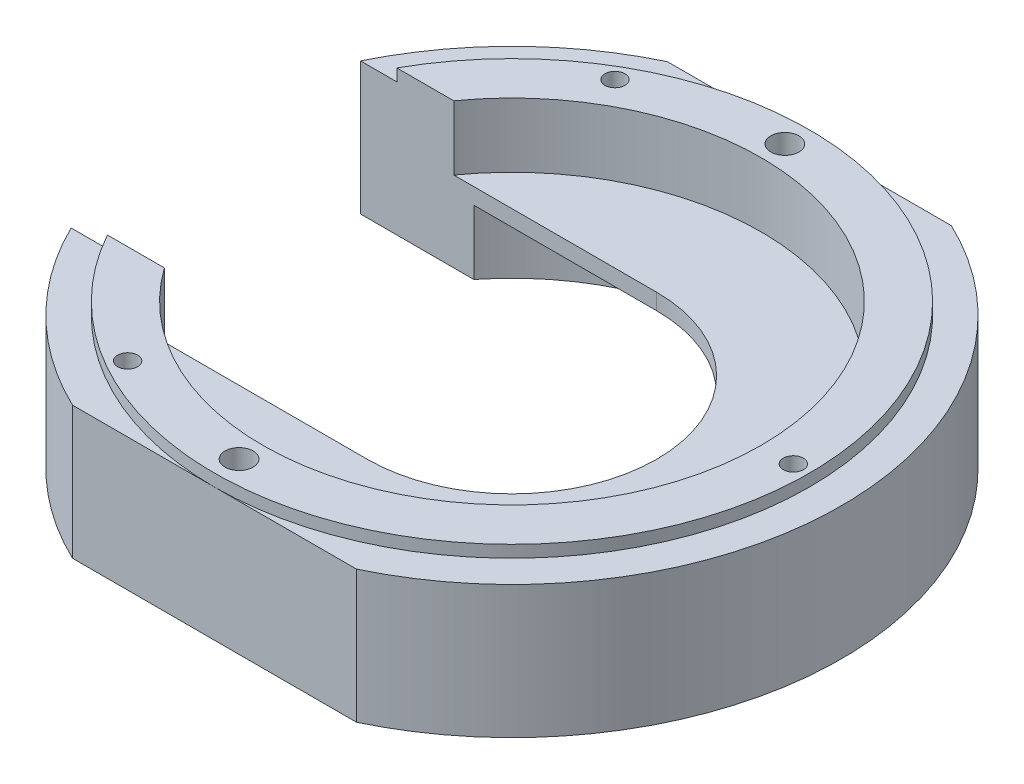
ISO-10303-21;
HEADER;
FILE_DESCRIPTION(('STEP AP214'),'2;1');
FILE_NAME('part.step','',(''),(''),'','','');
FILE_SCHEMA(('AUTOMOTIVE_DESIGN { 1 0 10303 214 1 1 1 1 }'));
ENDSEC;
DATA;
#1=APPLICATION_CONTEXT('core data for automotive mechanical design processes');
#2=APPLICATION_PROTOCOL_DEFINITION('international standard','automotive_design',2000,#1);
#3=PRODUCT_CONTEXT('',#1,'mechanical');
#4=PRODUCT('Part','Part','',(#3));
#5=PRODUCT_RELATED_PRODUCT_CATEGORY('part','',(#4));
#6=PRODUCT_DEFINITION_FORMATION('','',#4);
#7=PRODUCT_DEFINITION_CONTEXT('part definition',#1,'design');
#8=PRODUCT_DEFINITION('design','',#6,#7);
#9=PRODUCT_DEFINITION_SHAPE('','',#8);
#10=(LENGTH_UNIT() NAMED_UNIT(*) SI_UNIT(.MILLI.,.METRE.));
#11=(NAMED_UNIT(*) PLANE_ANGLE_UNIT() SI_UNIT($,.RADIAN.));
#12=(NAMED_UNIT(*) SI_UNIT($,.STERADIAN.) SOLID_ANGLE_UNIT());
#13=UNCERTAINTY_MEASURE_WITH_UNIT(LENGTH_MEASURE(1.E-05),#10,'distance_accuracy_value','');
#14=(GEOMETRIC_REPRESENTATION_CONTEXT(3) GLOBAL_UNCERTAINTY_ASSIGNED_CONTEXT((#13)) GLOBAL_UNIT_ASSIGNED_CONTEXT((#10,
#11,#12)) REPRESENTATION_CONTEXT('',''));
#15=CARTESIAN_POINT('',(0.,0.,0.));
#16=DIRECTION('',(0.,0.,1.));
#17=DIRECTION('',(1.,0.,0.));
#18=AXIS2_PLACEMENT_3D('',#15,#16,#17);
#19=CARTESIAN_POINT('',(0.,0.,0.));
#20=DIRECTION('',(0.,1.,0.));
#21=DIRECTION('',(0.,0.,1.));
#22=AXIS2_PLACEMENT_3D('',#19,#20,#21);
#23=PLANE('',#22);
#24=DIRECTION('',(1.,0.,0.));
#25=VECTOR('',#24,1.);
#26=CARTESIAN_POINT('',(0.,0.,18.));
#27=LINE('',#26,#25);
#28=CARTESIAN_POINT('',(-36.8374809127877,0.,18.));
#29=VERTEX_POINT('',#28);
#30=CARTESIAN_POINT('',(-22.7376340018041,0.,18.));
#31=VERTEX_POINT('',#30);
#32=EDGE_CURVE('E157',#29,#31,#27,.T.);
#33=ORIENTED_EDGE('',*,*,#32,.T.);
#34=CARTESIAN_POINT('',(0.,0.,0.));
#35=DIRECTION('',(0.,1.,0.));
#36=DIRECTION('',(0.,0.,1.));
#37=AXIS2_PLACEMENT_3D('',#34,#35,#36);
#38=CIRCLE('',#37,29.);
#39=CARTESIAN_POINT('',(-22.7376340018041,0.,-18.));
#40=VERTEX_POINT('',#39);
#41=EDGE_CURVE('E47',#31,#40,#38,.T.);
#42=ORIENTED_EDGE('',*,*,#41,.T.);
#43=DIRECTION('',(1.,0.,0.));
#44=VECTOR('',#43,1.);
#45=CARTESIAN_POINT('',(0.,0.,-18.));
#46=LINE('',#45,#44);
#47=CARTESIAN_POINT('',(-36.8374809127877,0.,-18.));
#48=VERTEX_POINT('',#47);
#49=EDGE_CURVE('E165',#48,#40,#46,.T.);
#50=ORIENTED_EDGE('',*,*,#49,.F.);
#51=CARTESIAN_POINT('',(0.,0.,0.));
#52=DIRECTION('',(0.,1.,0.));
#53=DIRECTION('',(0.,0.,1.));
#54=AXIS2_PLACEMENT_3D('',#51,#52,#53);
#55=CIRCLE('',#54,41.);
#56=CARTESIAN_POINT('',(-17.6635217326557,0.,-37.));
#57=VERTEX_POINT('',#56);
#58=EDGE_CURVE('E178',#57,#48,#55,.T.);
#59=ORIENTED_EDGE('',*,*,#58,.F.);
#60=DIRECTION('',(1.,0.,0.));
#61=VECTOR('',#60,1.);
#62=CARTESIAN_POINT('',(0.,0.,-37.));
#63=LINE('',#62,#61);
#64=CARTESIAN_POINT('',(17.6635217326557,0.,-37.));
#65=VERTEX_POINT('',#64);
#66=EDGE_CURVE('E177',#57,#65,#63,.T.);
#67=ORIENTED_EDGE('',*,*,#66,.T.);
#68=CARTESIAN_POINT('',(17.6635217326557,0.,37.));
#69=VERTEX_POINT('',#68);
#70=EDGE_CURVE('E174',#69,#65,#55,.T.);
#71=ORIENTED_EDGE('',*,*,#70,.F.);
#72=DIRECTION('',(1.,0.,0.));
#73=VECTOR('',#72,1.);
#74=CARTESIAN_POINT('',(0.,0.,37.));
#75=LINE('',#74,#73);
#76=CARTESIAN_POINT('',(-17.6635217326557,0.,37.));
#77=VERTEX_POINT('',#76);
#78=EDGE_CURVE('E167',#77,#69,#75,.T.);
#79=ORIENTED_EDGE('',*,*,#78,.F.);
#80=CARTESIAN_POINT('',(0.,0.,0.));
#81=DIRECTION('',(0.,1.,0.));
#82=DIRECTION('',(0.,0.,1.));
#83=AXIS2_PLACEMENT_3D('',#80,#81,#82);
#84=CIRCLE('',#83,41.);
#85=EDGE_CURVE('E164',#29,#77,#84,.T.);
#86=ORIENTED_EDGE('',*,*,#85,.F.);
#87=EDGE_LOOP('',(#33,#42,#50,#59,#67,#71,#79,#86));
#88=FACE_BOUND('',#87,.T.);
#89=CARTESIAN_POINT('',(35.,0.,0.));
#90=DIRECTION('',(0.,-1.,0.));
#91=DIRECTION('',(0.,0.,-1.));
#92=AXIS2_PLACEMENT_3D('',#89,#90,#91);
#93=CIRCLE('',#92,1.24999999999999);
#94=CARTESIAN_POINT('',(35.,0.,-1.24999999999999));
#95=VERTEX_POINT('',#94);
#96=EDGE_CURVE('E431',#95,#95,#93,.T.);
#97=ORIENTED_EDGE('',*,*,#96,.F.);
#98=EDGE_LOOP('',(#97));
#99=FACE_BOUND('',#98,.T.);
#100=CARTESIAN_POINT('',(-17.5000000000001,0.,30.3108891324553));
#101=DIRECTION('',(0.,-1.,0.));
#102=DIRECTION('',(0.,0.,-1.));
#103=AXIS2_PLACEMENT_3D('',#100,#101,#102);
#104=CIRCLE('',#103,1.24999999999999);
#105=CARTESIAN_POINT('',(-17.5000000000001,0.,29.0608891324553));
#106=VERTEX_POINT('',#105);
#107=EDGE_CURVE('E439',#106,#106,#104,.T.);
#108=ORIENTED_EDGE('',*,*,#107,.F.);
#109=EDGE_LOOP('',(#108));
#110=FACE_BOUND('',#109,.T.);
#111=CARTESIAN_POINT('',(-17.4999999999997,0.,-30.3108891324555));
#112=DIRECTION('',(0.,-1.,0.));
#113=DIRECTION('',(0.,0.,-1.));
#114=AXIS2_PLACEMENT_3D('',#111,#112,#113);
#115=CIRCLE('',#114,1.24999999999999);
#116=CARTESIAN_POINT('',(-17.4999999999997,0.,-31.5608891324555));
#117=VERTEX_POINT('',#116);
#118=EDGE_CURVE('E445',#117,#117,#115,.T.);
#119=ORIENTED_EDGE('',*,*,#118,.F.);
#120=EDGE_LOOP('',(#119));
#121=FACE_BOUND('',#120,.T.);
#122=CARTESIAN_POINT('',(0.,0.,33.95));
#123=DIRECTION('',(0.,-1.,0.));
#124=DIRECTION('',(0.,0.,-1.));
#125=AXIS2_PLACEMENT_3D('',#122,#123,#124);
#126=CIRCLE('',#125,3.);
#127=CARTESIAN_POINT('',(0.,0.,30.95));
#128=VERTEX_POINT('',#127);
#129=EDGE_CURVE('E457',#128,#128,#126,.T.);
#130=ORIENTED_EDGE('',*,*,#129,.F.);
#131=EDGE_LOOP('',(#130));
#132=FACE_BOUND('',#131,.T.);
#133=CARTESIAN_POINT('',(0.,0.,-33.95));
#134=DIRECTION('',(0.,-1.,0.));
#135=DIRECTION('',(0.,0.,-1.));
#136=AXIS2_PLACEMENT_3D('',#133,#134,#135);
#137=CIRCLE('',#136,3.);
#138=CARTESIAN_POINT('',(0.,0.,-36.95));
#139=VERTEX_POINT('',#138);
#140=EDGE_CURVE('E469',#139,#139,#137,.T.);
#141=ORIENTED_EDGE('',*,*,#140,.F.);
#142=EDGE_LOOP('',(#141));
#143=FACE_BOUND('',#142,.T.);
#144=ADVANCED_FACE('F39',(#88,#99,#110,#121,#132,#143),#23,.F.);
#145=CARTESIAN_POINT('',(0.,16.5,0.));
#146=DIRECTION('',(0.,-1.,0.));
#147=DIRECTION('',(0.,0.,-1.));
#148=AXIS2_PLACEMENT_3D('',#145,#146,#147);
#149=CYLINDRICAL_SURFACE('',#148,18.);
#150=CARTESIAN_POINT('',(0.,8.,0.));
#151=DIRECTION('',(0.,1.,0.));
#152=DIRECTION('',(0.,0.,1.));
#153=AXIS2_PLACEMENT_3D('',#150,#151,#152);
#154=CIRCLE('',#153,18.);
#155=CARTESIAN_POINT('',(0.,8.,18.));
#156=VERTEX_POINT('',#155);
#157=CARTESIAN_POINT('',(0.,8.,-18.));
#158=VERTEX_POINT('',#157);
#159=EDGE_CURVE('E217',#156,#158,#154,.T.);
#160=ORIENTED_EDGE('',*,*,#159,.F.);
#161=DIRECTION('',(0.,-1.,0.));
#162=VECTOR('',#161,1.);
#163=CARTESIAN_POINT('',(0.,16.5,18.));
#164=LINE('',#163,#162);
#165=CARTESIAN_POINT('',(0.,10.,18.));
#166=VERTEX_POINT('',#165);
#167=EDGE_CURVE('E197',#166,#156,#164,.T.);
#168=ORIENTED_EDGE('',*,*,#167,.F.);
#169=CARTESIAN_POINT('',(0.,10.,0.));
#170=DIRECTION('',(0.,1.,0.));
#171=DIRECTION('',(0.,0.,1.));
#172=AXIS2_PLACEMENT_3D('',#169,#170,#171);
#173=CIRCLE('',#172,18.);
#174=CARTESIAN_POINT('',(0.,10.,-18.));
#175=VERTEX_POINT('',#174);
#176=EDGE_CURVE('E215',#166,#175,#173,.T.);
#177=ORIENTED_EDGE('',*,*,#176,.T.);
#178=DIRECTION('',(0.,-1.,0.));
#179=VECTOR('',#178,1.);
#180=CARTESIAN_POINT('',(0.,16.5,-18.));
#181=LINE('',#180,#179);
#182=EDGE_CURVE('E199',#175,#158,#181,.T.);
#183=ORIENTED_EDGE('',*,*,#182,.T.);
#184=EDGE_LOOP('',(#160,#168,#177,#183));
#185=FACE_BOUND('',#184,.T.);
#186=ADVANCED_FACE('F214',(#185),#149,.F.);
#187=CARTESIAN_POINT('',(0.,16.5,0.));
#188=DIRECTION('',(0.,1.,0.));
#189=DIRECTION('',(0.,0.,1.));
#190=AXIS2_PLACEMENT_3D('',#187,#188,#189);
#191=PLANE('',#190);
#192=CARTESIAN_POINT('',(0.,16.5,0.));
#193=DIRECTION('',(0.,1.,0.));
#194=DIRECTION('',(0.,0.,1.));
#195=AXIS2_PLACEMENT_3D('',#192,#193,#194);
#196=CIRCLE('',#195,37.);
#197=CARTESIAN_POINT('',(-32.3264597504892,16.5,18.));
#198=VERTEX_POINT('',#197);
#199=CARTESIAN_POINT('',(0.,16.5,37.));
#200=VERTEX_POINT('',#199);
#201=EDGE_CURVE('E234',#198,#200,#196,.T.);
#202=ORIENTED_EDGE('',*,*,#201,.F.);
#203=DIRECTION('',(1.,0.,0.));
#204=VECTOR('',#203,1.);
#205=CARTESIAN_POINT('',(0.,16.5,18.));
#206=LINE('',#205,#204);
#207=CARTESIAN_POINT('',(-36.8374809127877,16.5,18.));
#208=VERTEX_POINT('',#207);
#209=EDGE_CURVE('E252',#208,#198,#206,.T.);
#210=ORIENTED_EDGE('',*,*,#209,.F.);
#211=CARTESIAN_POINT('',(0.,16.5,0.));
#212=DIRECTION('',(0.,1.,0.));
#213=DIRECTION('',(0.,0.,1.));
#214=AXIS2_PLACEMENT_3D('',#211,#212,#213);
#215=CIRCLE('',#214,41.);
#216=CARTESIAN_POINT('',(-17.6635217326557,16.5,37.));
#217=VERTEX_POINT('',#216);
#218=EDGE_CURVE('E255',#208,#217,#215,.T.);
#219=ORIENTED_EDGE('',*,*,#218,.T.);
#220=DIRECTION('',(1.,0.,0.));
#221=VECTOR('',#220,1.);
#222=CARTESIAN_POINT('',(0.,16.5,37.));
#223=LINE('',#222,#221);
#224=EDGE_CURVE('E258',#217,#200,#223,.T.);
#225=ORIENTED_EDGE('',*,*,#224,.T.);
#226=EDGE_LOOP('',(#202,#210,#219,#225));
#227=FACE_BOUND('',#226,.T.);
#228=ADVANCED_FACE('F297',(#227),#191,.T.);
#229=CARTESIAN_POINT('',(0.,16.5,-37.));
#230=VERTEX_POINT('',#229);
#231=EDGE_CURVE('E205',#200,#230,#196,.T.);
#232=ORIENTED_EDGE('',*,*,#231,.F.);
#233=CARTESIAN_POINT('',(17.6635217326557,16.5,37.));
#234=VERTEX_POINT('',#233);
#235=EDGE_CURVE('E257',#200,#234,#223,.T.);
#236=ORIENTED_EDGE('',*,*,#235,.T.);
#237=CARTESIAN_POINT('',(0.,16.5,0.));
#238=DIRECTION('',(0.,1.,0.));
#239=DIRECTION('',(0.,0.,1.));
#240=AXIS2_PLACEMENT_3D('',#237,#238,#239);
#241=CIRCLE('',#240,41.);
#242=CARTESIAN_POINT('',(17.6635217326557,16.5,-37.));
#243=VERTEX_POINT('',#242);
#244=EDGE_CURVE('E261',#234,#243,#241,.T.);
#245=ORIENTED_EDGE('',*,*,#244,.T.);
#246=DIRECTION('',(1.,0.,0.));
#247=VECTOR('',#246,1.);
#248=CARTESIAN_POINT('',(0.,16.5,-37.));
#249=LINE('',#248,#247);
#250=EDGE_CURVE('E263',#230,#243,#249,.T.);
#251=ORIENTED_EDGE('',*,*,#250,.F.);
#252=EDGE_LOOP('',(#232,#236,#245,#251));
#253=FACE_BOUND('',#252,.T.);
#254=ADVANCED_FACE('F275',(#253),#191,.T.);
#255=CARTESIAN_POINT('',(0.,16.5,-18.));
#256=DIRECTION('',(0.,0.,-1.));
#257=DIRECTION('',(-1.,0.,0.));
#258=AXIS2_PLACEMENT_3D('',#255,#256,#257);
#259=PLANE('',#258);
#260=DIRECTION('',(0.,-1.,0.));
#261=VECTOR('',#260,1.);
#262=CARTESIAN_POINT('',(-22.7376340018041,92.0243866176395,-18.));
#263=LINE('',#262,#261);
#264=CARTESIAN_POINT('',(-22.7376340018041,8.00000000000001,-18.));
#265=VERTEX_POINT('',#264);
#266=EDGE_CURVE('E54',#40,#265,#263,.F.);
#267=ORIENTED_EDGE('',*,*,#266,.T.);
#268=DIRECTION('',(1.,0.,0.));
#269=VECTOR('',#268,1.);
#270=CARTESIAN_POINT('',(0.,8.,-18.));
#271=LINE('',#270,#269);
#272=EDGE_CURVE('E220',#265,#158,#271,.T.);
#273=ORIENTED_EDGE('',*,*,#272,.T.);
#274=ORIENTED_EDGE('',*,*,#182,.F.);
#275=DIRECTION('',(1.,0.,0.));
#276=VECTOR('',#275,1.);
#277=CARTESIAN_POINT('',(0.,10.,-18.));
#278=LINE('',#277,#276);
#279=CARTESIAN_POINT('',(-25.2388589282479,10.,-18.));
#280=VERTEX_POINT('',#279);
#281=EDGE_CURVE('E232',#280,#175,#278,.T.);
#282=ORIENTED_EDGE('',*,*,#281,.F.);
#283=DIRECTION('',(0.,1.,0.));
#284=VECTOR('',#283,1.);
#285=CARTESIAN_POINT('',(-25.2388589282479,10.,-18.));
#286=LINE('',#285,#284);
#287=CARTESIAN_POINT('',(-25.2388589282479,18.,-18.));
#288=VERTEX_POINT('',#287);
#289=EDGE_CURVE('E228',#280,#288,#286,.T.);
#290=ORIENTED_EDGE('',*,*,#289,.T.);
#291=DIRECTION('',(1.,0.,0.));
#292=VECTOR('',#291,1.);
#293=CARTESIAN_POINT('',(0.,18.,-18.));
#294=LINE('',#293,#292);
#295=CARTESIAN_POINT('',(-32.3264597504892,18.,-18.));
#296=VERTEX_POINT('',#295);
#297=EDGE_CURVE('E238',#296,#288,#294,.T.);
#298=ORIENTED_EDGE('',*,*,#297,.F.);
#299=DIRECTION('',(0.,-1.,0.));
#300=VECTOR('',#299,1.);
#301=CARTESIAN_POINT('',(-32.3264597504892,18.,-18.));
#302=LINE('',#301,#300);
#303=CARTESIAN_POINT('',(-32.3264597504892,16.5,-18.));
#304=VERTEX_POINT('',#303);
#305=EDGE_CURVE('E169',#296,#304,#302,.T.);
#306=ORIENTED_EDGE('',*,*,#305,.T.);
#307=DIRECTION('',(1.,0.,0.));
#308=VECTOR('',#307,1.);
#309=CARTESIAN_POINT('',(0.,16.5,-18.));
#310=LINE('',#309,#308);
#311=CARTESIAN_POINT('',(-36.8374809127877,16.5,-18.));
#312=VERTEX_POINT('',#311);
#313=EDGE_CURVE('E250',#312,#304,#310,.T.);
#314=ORIENTED_EDGE('',*,*,#313,.F.);
#315=DIRECTION('',(0.,-1.,0.));
#316=VECTOR('',#315,1.);
#317=CARTESIAN_POINT('',(-36.8374809127877,16.5,-18.));
#318=LINE('',#317,#316);
#319=EDGE_CURVE('E181',#312,#48,#318,.T.);
#320=ORIENTED_EDGE('',*,*,#319,.T.);
#321=ORIENTED_EDGE('',*,*,#49,.T.);
#322=EDGE_LOOP('',(#267,#273,#274,#282,#290,#298,#306,#314,#320,#321));
#323=FACE_BOUND('',#322,.T.);
#324=ADVANCED_FACE('F41',(#323),#259,.F.);
#325=CARTESIAN_POINT('',(0.,16.5,18.));
#326=DIRECTION('',(0.,0.,-1.));
#327=DIRECTION('',(-1.,0.,0.));
#328=AXIS2_PLACEMENT_3D('',#325,#326,#327);
#329=PLANE('',#328);
#330=DIRECTION('',(1.,0.,0.));
#331=VECTOR('',#330,1.);
#332=CARTESIAN_POINT('',(0.,8.,18.));
#333=LINE('',#332,#331);
#334=CARTESIAN_POINT('',(-22.7376340018041,8.00000000000001,18.));
#335=VERTEX_POINT('',#334);
#336=EDGE_CURVE('E12',#335,#156,#333,.T.);
#337=ORIENTED_EDGE('',*,*,#336,.F.);
#338=DIRECTION('',(0.,-1.,0.));
#339=VECTOR('',#338,1.);
#340=CARTESIAN_POINT('',(-22.7376340018041,92.0243866176395,18.));
#341=LINE('',#340,#339);
#342=EDGE_CURVE('E146',#31,#335,#341,.F.);
#343=ORIENTED_EDGE('',*,*,#342,.F.);
#344=ORIENTED_EDGE('',*,*,#32,.F.);
#345=DIRECTION('',(0.,-1.,0.));
#346=VECTOR('',#345,1.);
#347=CARTESIAN_POINT('',(-36.8374809127877,16.5,18.));
#348=LINE('',#347,#346);
#349=EDGE_CURVE('E195',#208,#29,#348,.T.);
#350=ORIENTED_EDGE('',*,*,#349,.F.);
#351=ORIENTED_EDGE('',*,*,#209,.T.);
#352=DIRECTION('',(0.,-1.,0.));
#353=VECTOR('',#352,1.);
#354=CARTESIAN_POINT('',(-32.3264597504892,18.,18.));
#355=LINE('',#354,#353);
#356=CARTESIAN_POINT('',(-32.3264597504892,18.,18.));
#357=VERTEX_POINT('',#356);
#358=EDGE_CURVE('E243',#357,#198,#355,.T.);
#359=ORIENTED_EDGE('',*,*,#358,.F.);
#360=DIRECTION('',(-1.,0.,0.));
#361=VECTOR('',#360,1.);
#362=CARTESIAN_POINT('',(0.,18.,18.));
#363=LINE('',#362,#361);
#364=CARTESIAN_POINT('',(-25.2388589282479,18.,18.));
#365=VERTEX_POINT('',#364);
#366=EDGE_CURVE('E241',#365,#357,#363,.T.);
#367=ORIENTED_EDGE('',*,*,#366,.F.);
#368=DIRECTION('',(0.,1.,0.));
#369=VECTOR('',#368,1.);
#370=CARTESIAN_POINT('',(-25.2388589282479,10.,18.));
#371=LINE('',#370,#369);
#372=CARTESIAN_POINT('',(-25.2388589282479,10.,18.));
#373=VERTEX_POINT('',#372);
#374=EDGE_CURVE('E62',#373,#365,#371,.T.);
#375=ORIENTED_EDGE('',*,*,#374,.F.);
#376=DIRECTION('',(1.,0.,0.));
#377=VECTOR('',#376,1.);
#378=CARTESIAN_POINT('',(0.,10.,18.));
#379=LINE('',#378,#377);
#380=EDGE_CURVE('E152',#373,#166,#379,.T.);
#381=ORIENTED_EDGE('',*,*,#380,.T.);
#382=ORIENTED_EDGE('',*,*,#167,.T.);
#383=EDGE_LOOP('',(#337,#343,#344,#350,#351,#359,#367,#375,#381,#382));
#384=FACE_BOUND('',#383,.T.);
#385=ADVANCED_FACE('F156',(#384),#329,.T.);
#386=CARTESIAN_POINT('',(0.,16.5,0.));
#387=DIRECTION('',(0.,-1.,0.));
#388=DIRECTION('',(0.,0.,-1.));
#389=AXIS2_PLACEMENT_3D('',#386,#387,#388);
#390=CYLINDRICAL_SURFACE('',#389,41.);
#391=ORIENTED_EDGE('',*,*,#85,.T.);
#392=DIRECTION('',(0.,-1.,0.));
#393=VECTOR('',#392,1.);
#394=CARTESIAN_POINT('',(-17.6635217326557,16.5,37.));
#395=LINE('',#394,#393);
#396=EDGE_CURVE('E192',#217,#77,#395,.T.);
#397=ORIENTED_EDGE('',*,*,#396,.F.);
#398=ORIENTED_EDGE('',*,*,#218,.F.);
#399=ORIENTED_EDGE('',*,*,#349,.T.);
#400=EDGE_LOOP('',(#391,#397,#398,#399));
#401=FACE_BOUND('',#400,.T.);
#402=ADVANCED_FACE('F302',(#401),#390,.T.);
#403=CARTESIAN_POINT('',(0.,16.5,37.));
#404=DIRECTION('',(0.,0.,-1.));
#405=DIRECTION('',(-1.,0.,0.));
#406=AXIS2_PLACEMENT_3D('',#403,#404,#405);
#407=PLANE('',#406);
#408=ORIENTED_EDGE('',*,*,#78,.T.);
#409=DIRECTION('',(0.,-1.,0.));
#410=VECTOR('',#409,1.);
#411=CARTESIAN_POINT('',(17.6635217326557,16.5,37.));
#412=LINE('',#411,#410);
#413=EDGE_CURVE('E189',#234,#69,#412,.T.);
#414=ORIENTED_EDGE('',*,*,#413,.F.);
#415=ORIENTED_EDGE('',*,*,#235,.F.);
#416=ORIENTED_EDGE('',*,*,#224,.F.);
#417=ORIENTED_EDGE('',*,*,#396,.T.);
#418=EDGE_LOOP('',(#408,#414,#415,#416,#417));
#419=FACE_BOUND('',#418,.T.);
#420=ADVANCED_FACE('F295',(#419),#407,.F.);
#421=CARTESIAN_POINT('',(0.,16.5,0.));
#422=DIRECTION('',(0.,-1.,0.));
#423=DIRECTION('',(0.,0.,-1.));
#424=AXIS2_PLACEMENT_3D('',#421,#422,#423);
#425=CYLINDRICAL_SURFACE('',#424,41.);
#426=ORIENTED_EDGE('',*,*,#70,.T.);
#427=DIRECTION('',(0.,-1.,0.));
#428=VECTOR('',#427,1.);
#429=CARTESIAN_POINT('',(17.6635217326557,16.5,-37.));
#430=LINE('',#429,#428);
#431=EDGE_CURVE('E187',#243,#65,#430,.T.);
#432=ORIENTED_EDGE('',*,*,#431,.F.);
#433=ORIENTED_EDGE('',*,*,#244,.F.);
#434=ORIENTED_EDGE('',*,*,#413,.T.);
#435=EDGE_LOOP('',(#426,#432,#433,#434));
#436=FACE_BOUND('',#435,.T.);
#437=ADVANCED_FACE('F279',(#436),#425,.T.);
#438=CARTESIAN_POINT('',(0.,16.5,-37.));
#439=DIRECTION('',(0.,0.,-1.));
#440=DIRECTION('',(-1.,0.,0.));
#441=AXIS2_PLACEMENT_3D('',#438,#439,#440);
#442=PLANE('',#441);
#443=ORIENTED_EDGE('',*,*,#66,.F.);
#444=DIRECTION('',(0.,-1.,0.));
#445=VECTOR('',#444,1.);
#446=CARTESIAN_POINT('',(-17.6635217326557,16.5,-37.));
#447=LINE('',#446,#445);
#448=CARTESIAN_POINT('',(-17.6635217326557,16.5,-37.));
#449=VERTEX_POINT('',#448);
#450=EDGE_CURVE('E184',#449,#57,#447,.T.);
#451=ORIENTED_EDGE('',*,*,#450,.F.);
#452=EDGE_CURVE('E264',#449,#230,#249,.T.);
#453=ORIENTED_EDGE('',*,*,#452,.T.);
#454=ORIENTED_EDGE('',*,*,#250,.T.);
#455=ORIENTED_EDGE('',*,*,#431,.T.);
#456=EDGE_LOOP('',(#443,#451,#453,#454,#455));
#457=FACE_BOUND('',#456,.T.);
#458=ADVANCED_FACE('F271',(#457),#442,.T.);
#459=ORIENTED_EDGE('',*,*,#58,.T.);
#460=ORIENTED_EDGE('',*,*,#319,.F.);
#461=EDGE_CURVE('E185',#449,#312,#241,.T.);
#462=ORIENTED_EDGE('',*,*,#461,.F.);
#463=ORIENTED_EDGE('',*,*,#450,.T.);
#464=EDGE_LOOP('',(#459,#460,#462,#463));
#465=FACE_BOUND('',#464,.T.);
#466=ADVANCED_FACE('F285',(#465),#425,.T.);
#467=EDGE_CURVE('E202',#230,#304,#196,.T.);
#468=ORIENTED_EDGE('',*,*,#467,.F.);
#469=ORIENTED_EDGE('',*,*,#452,.F.);
#470=ORIENTED_EDGE('',*,*,#461,.T.);
#471=ORIENTED_EDGE('',*,*,#313,.T.);
#472=EDGE_LOOP('',(#468,#469,#470,#471));
#473=FACE_BOUND('',#472,.T.);
#474=ADVANCED_FACE('F288',(#473),#191,.T.);
#475=CARTESIAN_POINT('',(0.,18.,0.));
#476=DIRECTION('',(0.,-1.,0.));
#477=DIRECTION('',(0.,0.,-1.));
#478=AXIS2_PLACEMENT_3D('',#475,#476,#477);
#479=CYLINDRICAL_SURFACE('',#478,37.);
#480=ORIENTED_EDGE('',*,*,#201,.T.);
#481=ORIENTED_EDGE('',*,*,#231,.T.);
#482=ORIENTED_EDGE('',*,*,#467,.T.);
#483=ORIENTED_EDGE('',*,*,#305,.F.);
#484=CARTESIAN_POINT('',(0.,18.,0.));
#485=DIRECTION('',(0.,1.,0.));
#486=DIRECTION('',(0.,0.,1.));
#487=AXIS2_PLACEMENT_3D('',#484,#485,#486);
#488=CIRCLE('',#487,37.);
#489=EDGE_CURVE('E235',#357,#296,#488,.T.);
#490=ORIENTED_EDGE('',*,*,#489,.F.);
#491=ORIENTED_EDGE('',*,*,#358,.T.);
#492=EDGE_LOOP('',(#480,#481,#482,#483,#490,#491));
#493=FACE_BOUND('',#492,.T.);
#494=ADVANCED_FACE('F292',(#493),#479,.T.);
#495=CARTESIAN_POINT('',(0.,18.,0.));
#496=DIRECTION('',(0.,1.,0.));
#497=DIRECTION('',(0.,0.,1.));
#498=AXIS2_PLACEMENT_3D('',#495,#496,#497);
#499=PLANE('',#498);
#500=CARTESIAN_POINT('',(0.,18.,-33.95));
#501=DIRECTION('',(0.,1.,0.));
#502=DIRECTION('',(0.,0.,1.));
#503=AXIS2_PLACEMENT_3D('',#500,#501,#502);
#504=CIRCLE('',#503,1.75000000000001);
#505=CARTESIAN_POINT('',(0.,18.,-32.2));
#506=VERTEX_POINT('',#505);
#507=EDGE_CURVE('E460',#506,#506,#504,.T.);
#508=ORIENTED_EDGE('',*,*,#507,.F.);
#509=EDGE_LOOP('',(#508));
#510=FACE_BOUND('',#509,.T.);
#511=CARTESIAN_POINT('',(0.,18.,33.95));
#512=DIRECTION('',(0.,1.,0.));
#513=DIRECTION('',(0.,0.,1.));
#514=AXIS2_PLACEMENT_3D('',#511,#512,#513);
#515=CIRCLE('',#514,1.75000000000001);
#516=CARTESIAN_POINT('',(0.,18.,35.7));
#517=VERTEX_POINT('',#516);
#518=EDGE_CURVE('E448',#517,#517,#515,.T.);
#519=ORIENTED_EDGE('',*,*,#518,.F.);
#520=EDGE_LOOP('',(#519));
#521=FACE_BOUND('',#520,.T.);
#522=CARTESIAN_POINT('',(-17.4999999999997,18.,-30.3108891324555));
#523=DIRECTION('',(0.,1.,0.));
#524=DIRECTION('',(0.,0.,1.));
#525=AXIS2_PLACEMENT_3D('',#522,#523,#524);
#526=CIRCLE('',#525,1.24999999999999);
#527=CARTESIAN_POINT('',(-17.4999999999997,18.,-29.0608891324555));
#528=VERTEX_POINT('',#527);
#529=EDGE_CURVE('E442',#528,#528,#526,.T.);
#530=ORIENTED_EDGE('',*,*,#529,.F.);
#531=EDGE_LOOP('',(#530));
#532=FACE_BOUND('',#531,.T.);
#533=CARTESIAN_POINT('',(-17.5000000000001,18.,30.3108891324553));
#534=DIRECTION('',(0.,1.,0.));
#535=DIRECTION('',(0.,0.,1.));
#536=AXIS2_PLACEMENT_3D('',#533,#534,#535);
#537=CIRCLE('',#536,1.24999999999999);
#538=CARTESIAN_POINT('',(-17.5000000000001,18.,31.5608891324553));
#539=VERTEX_POINT('',#538);
#540=EDGE_CURVE('E436',#539,#539,#537,.T.);
#541=ORIENTED_EDGE('',*,*,#540,.F.);
#542=EDGE_LOOP('',(#541));
#543=FACE_BOUND('',#542,.T.);
#544=CARTESIAN_POINT('',(35.,18.,0.));
#545=DIRECTION('',(0.,1.,0.));
#546=DIRECTION('',(0.,0.,1.));
#547=AXIS2_PLACEMENT_3D('',#544,#545,#546);
#548=CIRCLE('',#547,1.24999999999999);
#549=CARTESIAN_POINT('',(35.,18.,1.24999999999999));
#550=VERTEX_POINT('',#549);
#551=EDGE_CURVE('E428',#550,#550,#548,.T.);
#552=ORIENTED_EDGE('',*,*,#551,.F.);
#553=EDGE_LOOP('',(#552));
#554=FACE_BOUND('',#553,.T.);
#555=CARTESIAN_POINT('',(0.,18.,0.));
#556=DIRECTION('',(0.,1.,0.));
#557=DIRECTION('',(0.,0.,1.));
#558=AXIS2_PLACEMENT_3D('',#555,#556,#557);
#559=CIRCLE('',#558,31.);
#560=EDGE_CURVE('E203',#365,#288,#559,.T.);
#561=ORIENTED_EDGE('',*,*,#560,.F.);
#562=ORIENTED_EDGE('',*,*,#366,.T.);
#563=ORIENTED_EDGE('',*,*,#489,.T.);
#564=ORIENTED_EDGE('',*,*,#297,.T.);
#565=EDGE_LOOP('',(#561,#562,#563,#564));
#566=FACE_BOUND('',#565,.T.);
#567=ADVANCED_FACE('F306',(#510,#521,#532,#543,#554,#566),#499,.T.);
#568=CARTESIAN_POINT('',(0.,10.,0.));
#569=DIRECTION('',(0.,1.,0.));
#570=DIRECTION('',(0.,0.,1.));
#571=AXIS2_PLACEMENT_3D('',#568,#569,#570);
#572=PLANE('',#571);
#573=ORIENTED_EDGE('',*,*,#281,.T.);
#574=ORIENTED_EDGE('',*,*,#176,.F.);
#575=ORIENTED_EDGE('',*,*,#380,.F.);
#576=CARTESIAN_POINT('',(0.,10.,0.));
#577=DIRECTION('',(0.,1.,0.));
#578=DIRECTION('',(0.,0.,1.));
#579=AXIS2_PLACEMENT_3D('',#576,#577,#578);
#580=CIRCLE('',#579,31.);
#581=EDGE_CURVE('E222',#373,#280,#580,.T.);
#582=ORIENTED_EDGE('',*,*,#581,.T.);
#583=EDGE_LOOP('',(#573,#574,#575,#582));
#584=FACE_BOUND('',#583,.T.);
#585=ADVANCED_FACE('F310',(#584),#572,.T.);
#586=CARTESIAN_POINT('',(0.,10.,0.));
#587=DIRECTION('',(0.,1.,0.));
#588=DIRECTION('',(0.,0.,1.));
#589=AXIS2_PLACEMENT_3D('',#586,#587,#588);
#590=CYLINDRICAL_SURFACE('',#589,31.);
#591=ORIENTED_EDGE('',*,*,#581,.F.);
#592=ORIENTED_EDGE('',*,*,#374,.T.);
#593=ORIENTED_EDGE('',*,*,#560,.T.);
#594=ORIENTED_EDGE('',*,*,#289,.F.);
#595=EDGE_LOOP('',(#591,#592,#593,#594));
#596=FACE_BOUND('',#595,.T.);
#597=ADVANCED_FACE('F307',(#596),#590,.F.);
#598=CARTESIAN_POINT('',(0.,8.,0.));
#599=DIRECTION('',(0.,1.,0.));
#600=DIRECTION('',(0.,0.,1.));
#601=AXIS2_PLACEMENT_3D('',#598,#599,#600);
#602=PLANE('',#601);
#603=CARTESIAN_POINT('',(0.,8.00000000000001,0.));
#604=DIRECTION('',(0.,1.,0.));
#605=DIRECTION('',(0.,0.,1.));
#606=AXIS2_PLACEMENT_3D('',#603,#604,#605);
#607=CIRCLE('',#606,29.);
#608=EDGE_CURVE('E159',#265,#335,#607,.F.);
#609=ORIENTED_EDGE('',*,*,#608,.T.);
#610=ORIENTED_EDGE('',*,*,#336,.T.);
#611=ORIENTED_EDGE('',*,*,#159,.T.);
#612=ORIENTED_EDGE('',*,*,#272,.F.);
#613=EDGE_LOOP('',(#609,#610,#611,#612));
#614=FACE_BOUND('',#613,.T.);
#615=ADVANCED_FACE('F317',(#614),#602,.F.);
#616=CARTESIAN_POINT('',(0.,92.0243866176395,0.));
#617=DIRECTION('',(0.,-1.,0.));
#618=DIRECTION('',(0.,0.,-1.));
#619=AXIS2_PLACEMENT_3D('',#616,#617,#618);
#620=CYLINDRICAL_SURFACE('',#619,29.);
#621=ORIENTED_EDGE('',*,*,#41,.F.);
#622=ORIENTED_EDGE('',*,*,#342,.T.);
#623=ORIENTED_EDGE('',*,*,#608,.F.);
#624=ORIENTED_EDGE('',*,*,#266,.F.);
#625=EDGE_LOOP('',(#621,#622,#623,#624));
#626=FACE_BOUND('',#625,.T.);
#627=ADVANCED_FACE('F145',(#626),#620,.F.);
#628=CARTESIAN_POINT('',(35.,0.,0.));
#629=DIRECTION('',(0.,-1.,0.));
#630=DIRECTION('',(0.,0.,-1.));
#631=AXIS2_PLACEMENT_3D('',#628,#629,#630);
#632=CYLINDRICAL_SURFACE('',#631,1.24999999999999);
#633=ORIENTED_EDGE('',*,*,#96,.T.);
#634=EDGE_LOOP('',(#633));
#635=FACE_BOUND('',#634,.T.);
#636=ORIENTED_EDGE('',*,*,#551,.T.);
#637=EDGE_LOOP('',(#636));
#638=FACE_BOUND('',#637,.T.);
#639=ADVANCED_FACE('F419',(#635,#638),#632,.F.);
#640=CARTESIAN_POINT('',(-17.5000000000001,0.,30.3108891324553));
#641=DIRECTION('',(0.,-1.,0.));
#642=DIRECTION('',(0.,0.,-1.));
#643=AXIS2_PLACEMENT_3D('',#640,#641,#642);
#644=CYLINDRICAL_SURFACE('',#643,1.24999999999999);
#645=ORIENTED_EDGE('',*,*,#107,.T.);
#646=EDGE_LOOP('',(#645));
#647=FACE_BOUND('',#646,.T.);
#648=ORIENTED_EDGE('',*,*,#540,.T.);
#649=EDGE_LOOP('',(#648));
#650=FACE_BOUND('',#649,.T.);
#651=ADVANCED_FACE('F415',(#647,#650),#644,.F.);
#652=CARTESIAN_POINT('',(-17.4999999999997,0.,-30.3108891324555));
#653=DIRECTION('',(0.,-1.,0.));
#654=DIRECTION('',(0.,0.,-1.));
#655=AXIS2_PLACEMENT_3D('',#652,#653,#654);
#656=CYLINDRICAL_SURFACE('',#655,1.24999999999999);
#657=ORIENTED_EDGE('',*,*,#118,.T.);
#658=EDGE_LOOP('',(#657));
#659=FACE_BOUND('',#658,.T.);
#660=ORIENTED_EDGE('',*,*,#529,.T.);
#661=EDGE_LOOP('',(#660));
#662=FACE_BOUND('',#661,.T.);
#663=ADVANCED_FACE('F411',(#659,#662),#656,.F.);
#664=CARTESIAN_POINT('',(0.,0.,33.95));
#665=DIRECTION('',(0.,-1.,0.));
#666=DIRECTION('',(0.,0.,-1.));
#667=AXIS2_PLACEMENT_3D('',#664,#665,#666);
#668=CYLINDRICAL_SURFACE('',#667,1.75000000000001);
#669=CARTESIAN_POINT('',(0.,4.,33.95));
#670=DIRECTION('',(0.,-1.,0.));
#671=DIRECTION('',(0.,0.,-1.));
#672=AXIS2_PLACEMENT_3D('',#669,#670,#671);
#673=CIRCLE('',#672,1.75000000000001);
#674=CARTESIAN_POINT('',(0.,4.,32.2));
#675=VERTEX_POINT('',#674);
#676=EDGE_CURVE('E451',#675,#675,#673,.T.);
#677=ORIENTED_EDGE('',*,*,#676,.T.);
#678=EDGE_LOOP('',(#677));
#679=FACE_BOUND('',#678,.T.);
#680=ORIENTED_EDGE('',*,*,#518,.T.);
#681=EDGE_LOOP('',(#680));
#682=FACE_BOUND('',#681,.T.);
#683=ADVANCED_FACE('F407',(#679,#682),#668,.F.);
#684=CARTESIAN_POINT('',(1.75000000000001,4.,33.95));
#685=DIRECTION('',(0.,1.,0.));
#686=DIRECTION('',(0.,0.,1.));
#687=AXIS2_PLACEMENT_3D('',#684,#685,#686);
#688=PLANE('',#687);
#689=ORIENTED_EDGE('',*,*,#676,.F.);
#690=EDGE_LOOP('',(#689));
#691=FACE_BOUND('',#690,.T.);
#692=CARTESIAN_POINT('',(0.,4.,33.95));
#693=DIRECTION('',(0.,-1.,0.));
#694=DIRECTION('',(0.,0.,-1.));
#695=AXIS2_PLACEMENT_3D('',#692,#693,#694);
#696=CIRCLE('',#695,3.);
#697=CARTESIAN_POINT('',(0.,4.,30.95));
#698=VERTEX_POINT('',#697);
#699=EDGE_CURVE('E454',#698,#698,#696,.T.);
#700=ORIENTED_EDGE('',*,*,#699,.T.);
#701=EDGE_LOOP('',(#700));
#702=FACE_BOUND('',#701,.T.);
#703=ADVANCED_FACE('F403',(#691,#702),#688,.F.);
#704=CARTESIAN_POINT('',(0.,0.,33.95));
#705=DIRECTION('',(0.,-1.,0.));
#706=DIRECTION('',(0.,0.,-1.));
#707=AXIS2_PLACEMENT_3D('',#704,#705,#706);
#708=CYLINDRICAL_SURFACE('',#707,3.);
#709=ORIENTED_EDGE('',*,*,#699,.F.);
#710=EDGE_LOOP('',(#709));
#711=FACE_BOUND('',#710,.T.);
#712=ORIENTED_EDGE('',*,*,#129,.T.);
#713=EDGE_LOOP('',(#712));
#714=FACE_BOUND('',#713,.T.);
#715=ADVANCED_FACE('F373',(#711,#714),#708,.F.);
#716=CARTESIAN_POINT('',(0.,0.,-33.95));
#717=DIRECTION('',(0.,-1.,0.));
#718=DIRECTION('',(0.,0.,-1.));
#719=AXIS2_PLACEMENT_3D('',#716,#717,#718);
#720=CYLINDRICAL_SURFACE('',#719,1.75000000000001);
#721=CARTESIAN_POINT('',(0.,4.,-33.95));
#722=DIRECTION('',(0.,-1.,0.));
#723=DIRECTION('',(0.,0.,-1.));
#724=AXIS2_PLACEMENT_3D('',#721,#722,#723);
#725=CIRCLE('',#724,1.75000000000001);
#726=CARTESIAN_POINT('',(0.,4.,-35.7));
#727=VERTEX_POINT('',#726);
#728=EDGE_CURVE('E463',#727,#727,#725,.T.);
#729=ORIENTED_EDGE('',*,*,#728,.T.);
#730=EDGE_LOOP('',(#729));
#731=FACE_BOUND('',#730,.T.);
#732=ORIENTED_EDGE('',*,*,#507,.T.);
#733=EDGE_LOOP('',(#732));
#734=FACE_BOUND('',#733,.T.);
#735=ADVANCED_FACE('F367',(#731,#734),#720,.F.);
#736=CARTESIAN_POINT('',(1.75000000000001,4.,-33.95));
#737=DIRECTION('',(0.,1.,0.));
#738=DIRECTION('',(0.,0.,1.));
#739=AXIS2_PLACEMENT_3D('',#736,#737,#738);
#740=PLANE('',#739);
#741=ORIENTED_EDGE('',*,*,#728,.F.);
#742=EDGE_LOOP('',(#741));
#743=FACE_BOUND('',#742,.T.);
#744=CARTESIAN_POINT('',(0.,4.,-33.95));
#745=DIRECTION('',(0.,-1.,0.));
#746=DIRECTION('',(0.,0.,-1.));
#747=AXIS2_PLACEMENT_3D('',#744,#745,#746);
#748=CIRCLE('',#747,3.);
#749=CARTESIAN_POINT('',(0.,4.,-36.95));
#750=VERTEX_POINT('',#749);
#751=EDGE_CURVE('E466',#750,#750,#748,.T.);
#752=ORIENTED_EDGE('',*,*,#751,.T.);
#753=EDGE_LOOP('',(#752));
#754=FACE_BOUND('',#753,.T.);
#755=ADVANCED_FACE('F372',(#743,#754),#740,.F.);
#756=CARTESIAN_POINT('',(0.,0.,-33.95));
#757=DIRECTION('',(0.,-1.,0.));
#758=DIRECTION('',(0.,0.,-1.));
#759=AXIS2_PLACEMENT_3D('',#756,#757,#758);
#760=CYLINDRICAL_SURFACE('',#759,3.);
#761=ORIENTED_EDGE('',*,*,#751,.F.);
#762=EDGE_LOOP('',(#761));
#763=FACE_BOUND('',#762,.T.);
#764=ORIENTED_EDGE('',*,*,#140,.T.);
#765=EDGE_LOOP('',(#764));
#766=FACE_BOUND('',#765,.T.);
#767=ADVANCED_FACE('F385',(#763,#766),#760,.F.);
#768=CLOSED_SHELL('',(#144,#186,#228,#254,#324,#385,#402,#420,#437,#458,#466,#474,#494,#567,
#585,#597,#615,#627,#639,#651,#663,#683,#703,#715,#735,#755,#767));
#769=MANIFOLD_SOLID_BREP('B2',#768);
#770=ADVANCED_BREP_SHAPE_REPRESENTATION('',(#18,#769),#14);
#771=SHAPE_DEFINITION_REPRESENTATION(#9,#770);
ENDSEC;
END-ISO-10303-21;
